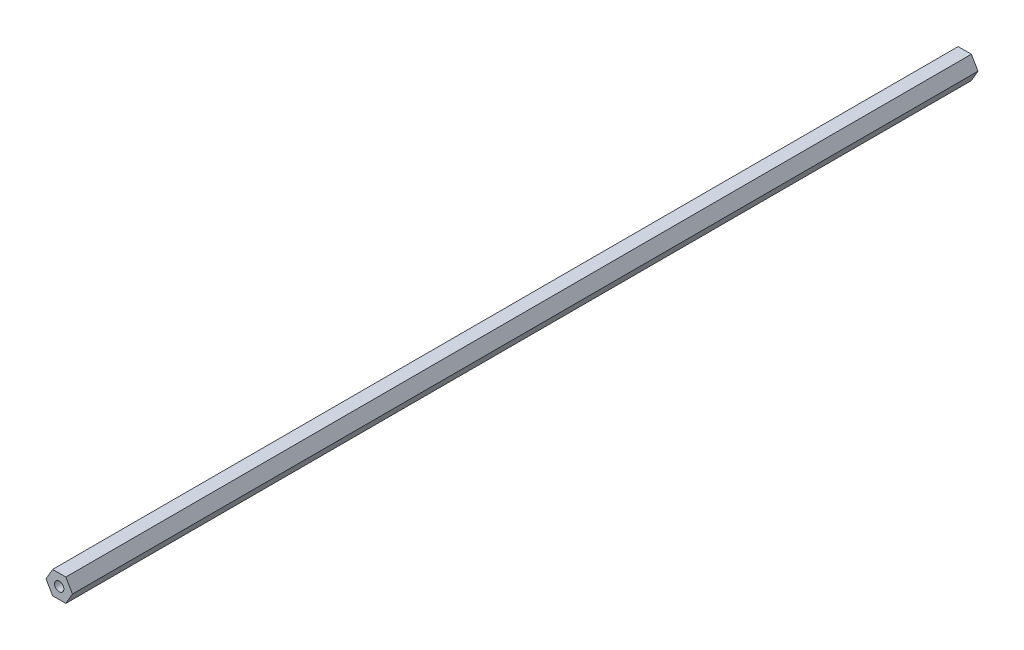
ISO-10303-21;
HEADER;
FILE_DESCRIPTION(('STEP AP214'),'2;1');
FILE_NAME('part.step','',(''),(''),'','','');
FILE_SCHEMA(('AUTOMOTIVE_DESIGN { 1 0 10303 214 1 1 1 1 }'));
ENDSEC;
DATA;
#1=APPLICATION_CONTEXT('core data for automotive mechanical design processes');
#2=APPLICATION_PROTOCOL_DEFINITION('international standard','automotive_design',2000,#1);
#3=PRODUCT_CONTEXT('',#1,'mechanical');
#4=PRODUCT('Part','Part','',(#3));
#5=PRODUCT_RELATED_PRODUCT_CATEGORY('part','',(#4));
#6=PRODUCT_DEFINITION_FORMATION('','',#4);
#7=PRODUCT_DEFINITION_CONTEXT('part definition',#1,'design');
#8=PRODUCT_DEFINITION('design','',#6,#7);
#9=PRODUCT_DEFINITION_SHAPE('','',#8);
#10=(LENGTH_UNIT() NAMED_UNIT(*) SI_UNIT(.MILLI.,.METRE.));
#11=(NAMED_UNIT(*) PLANE_ANGLE_UNIT() SI_UNIT($,.RADIAN.));
#12=(NAMED_UNIT(*) SI_UNIT($,.STERADIAN.) SOLID_ANGLE_UNIT());
#13=UNCERTAINTY_MEASURE_WITH_UNIT(LENGTH_MEASURE(1.E-05),#10,'distance_accuracy_value','');
#14=(GEOMETRIC_REPRESENTATION_CONTEXT(3) GLOBAL_UNCERTAINTY_ASSIGNED_CONTEXT((#13)) GLOBAL_UNIT_ASSIGNED_CONTEXT((#10,
#11,#12)) REPRESENTATION_CONTEXT('',''));
#15=CARTESIAN_POINT('',(0.,0.,0.));
#16=DIRECTION('',(0.,0.,1.));
#17=DIRECTION('',(1.,0.,0.));
#18=AXIS2_PLACEMENT_3D('',#15,#16,#17);
#19=CARTESIAN_POINT('',(3.66617420935412,-6.35,502.3485));
#20=DIRECTION('',(-0.866025403784439,0.5,0.));
#21=DIRECTION('',(-0.5,-0.866025403784439,0.));
#22=AXIS2_PLACEMENT_3D('',#19,#20,#21);
#23=PLANE('',#22);
#24=DIRECTION('',(0.5,0.866025403784439,0.));
#25=VECTOR('',#24,1.);
#26=CARTESIAN_POINT('',(3.66617420935412,-6.35,0.));
#27=LINE('',#26,#25);
#28=CARTESIAN_POINT('',(3.66617420935412,-6.35,0.));
#29=VERTEX_POINT('',#28);
#30=CARTESIAN_POINT('',(7.33234841870825,0.,0.));
#31=VERTEX_POINT('',#30);
#32=EDGE_CURVE('E118',#29,#31,#27,.T.);
#33=ORIENTED_EDGE('',*,*,#32,.T.);
#34=DIRECTION('',(0.,0.,-1.));
#35=VECTOR('',#34,1.);
#36=CARTESIAN_POINT('',(7.33234841870825,0.,502.3485));
#37=LINE('',#36,#35);
#38=CARTESIAN_POINT('',(7.33234841870825,0.,502.3485));
#39=VERTEX_POINT('',#38);
#40=EDGE_CURVE('E11',#39,#31,#37,.T.);
#41=ORIENTED_EDGE('',*,*,#40,.F.);
#42=DIRECTION('',(0.5,0.866025403784439,0.));
#43=VECTOR('',#42,1.);
#44=CARTESIAN_POINT('',(3.66617420935412,-6.35,502.3485));
#45=LINE('',#44,#43);
#46=CARTESIAN_POINT('',(3.66617420935412,-6.35,502.3485));
#47=VERTEX_POINT('',#46);
#48=EDGE_CURVE('E129',#47,#39,#45,.T.);
#49=ORIENTED_EDGE('',*,*,#48,.F.);
#50=DIRECTION('',(0.,0.,-1.));
#51=VECTOR('',#50,1.);
#52=CARTESIAN_POINT('',(3.66617420935412,-6.35,502.3485));
#53=LINE('',#52,#51);
#54=EDGE_CURVE('E114',#47,#29,#53,.T.);
#55=ORIENTED_EDGE('',*,*,#54,.T.);
#56=EDGE_LOOP('',(#33,#41,#49,#55));
#57=FACE_BOUND('',#56,.T.);
#58=ADVANCED_FACE('F34',(#57),#23,.F.);
#59=CARTESIAN_POINT('',(7.33234841870825,0.,502.3485));
#60=DIRECTION('',(-0.866025403784439,-0.5,0.));
#61=DIRECTION('',(0.5,-0.866025403784439,0.));
#62=AXIS2_PLACEMENT_3D('',#59,#60,#61);
#63=PLANE('',#62);
#64=DIRECTION('',(-0.5,0.866025403784438,0.));
#65=VECTOR('',#64,1.);
#66=CARTESIAN_POINT('',(7.33234841870825,0.,0.));
#67=LINE('',#66,#65);
#68=CARTESIAN_POINT('',(3.66617420935412,6.35,0.));
#69=VERTEX_POINT('',#68);
#70=EDGE_CURVE('E121',#31,#69,#67,.T.);
#71=ORIENTED_EDGE('',*,*,#70,.T.);
#72=DIRECTION('',(0.,0.,-1.));
#73=VECTOR('',#72,1.);
#74=CARTESIAN_POINT('',(3.66617420935412,6.35,502.3485));
#75=LINE('',#74,#73);
#76=CARTESIAN_POINT('',(3.66617420935412,6.35,502.3485));
#77=VERTEX_POINT('',#76);
#78=EDGE_CURVE('E42',#77,#69,#75,.T.);
#79=ORIENTED_EDGE('',*,*,#78,.F.);
#80=DIRECTION('',(-0.5,0.866025403784438,0.));
#81=VECTOR('',#80,1.);
#82=CARTESIAN_POINT('',(7.33234841870825,0.,502.3485));
#83=LINE('',#82,#81);
#84=EDGE_CURVE('E87',#39,#77,#83,.T.);
#85=ORIENTED_EDGE('',*,*,#84,.F.);
#86=ORIENTED_EDGE('',*,*,#40,.T.);
#87=EDGE_LOOP('',(#71,#79,#85,#86));
#88=FACE_BOUND('',#87,.T.);
#89=ADVANCED_FACE('F154',(#88),#63,.F.);
#90=CARTESIAN_POINT('',(3.66617420935412,6.35,502.3485));
#91=DIRECTION('',(0.,-1.,0.));
#92=DIRECTION('',(0.,0.,-1.));
#93=AXIS2_PLACEMENT_3D('',#90,#91,#92);
#94=PLANE('',#93);
#95=DIRECTION('',(-1.,0.,0.));
#96=VECTOR('',#95,1.);
#97=CARTESIAN_POINT('',(3.66617420935412,6.35,0.));
#98=LINE('',#97,#96);
#99=CARTESIAN_POINT('',(-3.66617420935412,6.35,0.));
#100=VERTEX_POINT('',#99);
#101=EDGE_CURVE('E124',#69,#100,#98,.T.);
#102=ORIENTED_EDGE('',*,*,#101,.T.);
#103=DIRECTION('',(0.,0.,-1.));
#104=VECTOR('',#103,1.);
#105=CARTESIAN_POINT('',(-3.66617420935412,6.35,502.3485));
#106=LINE('',#105,#104);
#107=CARTESIAN_POINT('',(-3.66617420935412,6.35,502.3485));
#108=VERTEX_POINT('',#107);
#109=EDGE_CURVE('E109',#108,#100,#106,.T.);
#110=ORIENTED_EDGE('',*,*,#109,.F.);
#111=DIRECTION('',(-1.,0.,0.));
#112=VECTOR('',#111,1.);
#113=CARTESIAN_POINT('',(3.66617420935412,6.35,502.3485));
#114=LINE('',#113,#112);
#115=EDGE_CURVE('E100',#77,#108,#114,.T.);
#116=ORIENTED_EDGE('',*,*,#115,.F.);
#117=ORIENTED_EDGE('',*,*,#78,.T.);
#118=EDGE_LOOP('',(#102,#110,#116,#117));
#119=FACE_BOUND('',#118,.T.);
#120=ADVANCED_FACE('F135',(#119),#94,.F.);
#121=CARTESIAN_POINT('',(-3.66617420935412,6.35,502.3485));
#122=DIRECTION('',(0.866025403784439,-0.5,0.));
#123=DIRECTION('',(0.5,0.866025403784439,0.));
#124=AXIS2_PLACEMENT_3D('',#121,#122,#123);
#125=PLANE('',#124);
#126=DIRECTION('',(-0.5,-0.866025403784439,0.));
#127=VECTOR('',#126,1.);
#128=CARTESIAN_POINT('',(-3.66617420935412,6.35,0.));
#129=LINE('',#128,#127);
#130=CARTESIAN_POINT('',(-7.33234841870825,0.,0.));
#131=VERTEX_POINT('',#130);
#132=EDGE_CURVE('E108',#100,#131,#129,.T.);
#133=ORIENTED_EDGE('',*,*,#132,.T.);
#134=DIRECTION('',(0.,0.,-1.));
#135=VECTOR('',#134,1.);
#136=CARTESIAN_POINT('',(-7.33234841870825,0.,502.3485));
#137=LINE('',#136,#135);
#138=CARTESIAN_POINT('',(-7.33234841870825,0.,502.3485));
#139=VERTEX_POINT('',#138);
#140=EDGE_CURVE('E105',#139,#131,#137,.T.);
#141=ORIENTED_EDGE('',*,*,#140,.F.);
#142=DIRECTION('',(-0.5,-0.866025403784439,0.));
#143=VECTOR('',#142,1.);
#144=CARTESIAN_POINT('',(-3.66617420935412,6.35,502.3485));
#145=LINE('',#144,#143);
#146=EDGE_CURVE('E94',#108,#139,#145,.T.);
#147=ORIENTED_EDGE('',*,*,#146,.F.);
#148=ORIENTED_EDGE('',*,*,#109,.T.);
#149=EDGE_LOOP('',(#133,#141,#147,#148));
#150=FACE_BOUND('',#149,.T.);
#151=ADVANCED_FACE('F106',(#150),#125,.F.);
#152=CARTESIAN_POINT('',(-7.33234841870825,0.,502.3485));
#153=DIRECTION('',(0.866025403784439,0.5,0.));
#154=DIRECTION('',(-0.5,0.866025403784439,0.));
#155=AXIS2_PLACEMENT_3D('',#152,#153,#154);
#156=PLANE('',#155);
#157=DIRECTION('',(0.5,-0.866025403784438,0.));
#158=VECTOR('',#157,1.);
#159=CARTESIAN_POINT('',(-7.33234841870825,0.,0.));
#160=LINE('',#159,#158);
#161=CARTESIAN_POINT('',(-3.66617420935412,-6.35,0.));
#162=VERTEX_POINT('',#161);
#163=EDGE_CURVE('E73',#131,#162,#160,.T.);
#164=ORIENTED_EDGE('',*,*,#163,.T.);
#165=DIRECTION('',(0.,0.,-1.));
#166=VECTOR('',#165,1.);
#167=CARTESIAN_POINT('',(-3.66617420935412,-6.35,502.3485));
#168=LINE('',#167,#166);
#169=CARTESIAN_POINT('',(-3.66617420935412,-6.35,502.3485));
#170=VERTEX_POINT('',#169);
#171=EDGE_CURVE('E110',#170,#162,#168,.T.);
#172=ORIENTED_EDGE('',*,*,#171,.F.);
#173=DIRECTION('',(0.5,-0.866025403784438,0.));
#174=VECTOR('',#173,1.);
#175=CARTESIAN_POINT('',(-7.33234841870825,0.,502.3485));
#176=LINE('',#175,#174);
#177=EDGE_CURVE('E98',#139,#170,#176,.T.);
#178=ORIENTED_EDGE('',*,*,#177,.F.);
#179=ORIENTED_EDGE('',*,*,#140,.T.);
#180=EDGE_LOOP('',(#164,#172,#178,#179));
#181=FACE_BOUND('',#180,.T.);
#182=ADVANCED_FACE('F112',(#181),#156,.F.);
#183=CARTESIAN_POINT('',(-3.66617420935412,-6.35,502.3485));
#184=DIRECTION('',(0.,1.,0.));
#185=DIRECTION('',(-1.,0.,0.));
#186=AXIS2_PLACEMENT_3D('',#183,#184,#185);
#187=PLANE('',#186);
#188=DIRECTION('',(1.,0.,0.));
#189=VECTOR('',#188,1.);
#190=CARTESIAN_POINT('',(-3.66617420935412,-6.35,0.));
#191=LINE('',#190,#189);
#192=EDGE_CURVE('E79',#162,#29,#191,.T.);
#193=ORIENTED_EDGE('',*,*,#192,.T.);
#194=ORIENTED_EDGE('',*,*,#54,.F.);
#195=DIRECTION('',(1.,0.,0.));
#196=VECTOR('',#195,1.);
#197=CARTESIAN_POINT('',(-3.66617420935412,-6.35,502.3485));
#198=LINE('',#197,#196);
#199=EDGE_CURVE('E50',#170,#47,#198,.T.);
#200=ORIENTED_EDGE('',*,*,#199,.F.);
#201=ORIENTED_EDGE('',*,*,#171,.T.);
#202=EDGE_LOOP('',(#193,#194,#200,#201));
#203=FACE_BOUND('',#202,.T.);
#204=ADVANCED_FACE('F142',(#203),#187,.F.);
#205=CARTESIAN_POINT('',(0.,0.,502.3485));
#206=DIRECTION('',(0.,0.,1.));
#207=DIRECTION('',(1.,0.,0.));
#208=AXIS2_PLACEMENT_3D('',#205,#206,#207);
#209=PLANE('',#208);
#210=CARTESIAN_POINT('',(0.,0.,502.3485));
#211=DIRECTION('',(0.,0.,1.));
#212=DIRECTION('',(1.,0.,0.));
#213=AXIS2_PLACEMENT_3D('',#210,#211,#212);
#214=CIRCLE('',#213,2.5796875);
#215=CARTESIAN_POINT('',(2.5796875,0.,502.3485));
#216=VERTEX_POINT('',#215);
#217=EDGE_CURVE('E209',#216,#216,#214,.T.);
#218=ORIENTED_EDGE('',*,*,#217,.F.);
#219=EDGE_LOOP('',(#218));
#220=FACE_BOUND('',#219,.T.);
#221=ORIENTED_EDGE('',*,*,#48,.T.);
#222=ORIENTED_EDGE('',*,*,#84,.T.);
#223=ORIENTED_EDGE('',*,*,#115,.T.);
#224=ORIENTED_EDGE('',*,*,#146,.T.);
#225=ORIENTED_EDGE('',*,*,#177,.T.);
#226=ORIENTED_EDGE('',*,*,#199,.T.);
#227=EDGE_LOOP('',(#221,#222,#223,#224,#225,#226));
#228=FACE_BOUND('',#227,.T.);
#229=ADVANCED_FACE('F96',(#220,#228),#209,.T.);
#230=CARTESIAN_POINT('',(0.,0.,0.));
#231=DIRECTION('',(0.,0.,1.));
#232=DIRECTION('',(1.,0.,0.));
#233=AXIS2_PLACEMENT_3D('',#230,#231,#232);
#234=PLANE('',#233);
#235=CARTESIAN_POINT('',(0.,0.,0.));
#236=DIRECTION('',(0.,0.,1.));
#237=DIRECTION('',(1.,0.,0.));
#238=AXIS2_PLACEMENT_3D('',#235,#236,#237);
#239=CIRCLE('',#238,2.5796875);
#240=CARTESIAN_POINT('',(2.5796875,0.,0.));
#241=VERTEX_POINT('',#240);
#242=EDGE_CURVE('E122',#241,#241,#239,.T.);
#243=ORIENTED_EDGE('',*,*,#242,.T.);
#244=EDGE_LOOP('',(#243));
#245=FACE_BOUND('',#244,.T.);
#246=ORIENTED_EDGE('',*,*,#32,.F.);
#247=ORIENTED_EDGE('',*,*,#192,.F.);
#248=ORIENTED_EDGE('',*,*,#163,.F.);
#249=ORIENTED_EDGE('',*,*,#132,.F.);
#250=ORIENTED_EDGE('',*,*,#101,.F.);
#251=ORIENTED_EDGE('',*,*,#70,.F.);
#252=EDGE_LOOP('',(#246,#247,#248,#249,#250,#251));
#253=FACE_BOUND('',#252,.T.);
#254=ADVANCED_FACE('F138',(#245,#253),#234,.F.);
#255=CARTESIAN_POINT('',(0.,0.,0.));
#256=DIRECTION('',(0.,0.,1.));
#257=DIRECTION('',(1.,0.,0.));
#258=AXIS2_PLACEMENT_3D('',#255,#256,#257);
#259=CYLINDRICAL_SURFACE('',#258,2.5796875);
#260=ORIENTED_EDGE('',*,*,#242,.F.);
#261=EDGE_LOOP('',(#260));
#262=FACE_BOUND('',#261,.T.);
#263=ORIENTED_EDGE('',*,*,#217,.T.);
#264=EDGE_LOOP('',(#263));
#265=FACE_BOUND('',#264,.T.);
#266=ADVANCED_FACE('F191',(#262,#265),#259,.F.);
#267=CLOSED_SHELL('',(#58,#89,#120,#151,#182,#204,#229,#254,#266));
#268=MANIFOLD_SOLID_BREP('B2',#267);
#269=ADVANCED_BREP_SHAPE_REPRESENTATION('',(#18,#268),#14);
#270=SHAPE_DEFINITION_REPRESENTATION(#9,#269);
ENDSEC;
END-ISO-10303-21;
